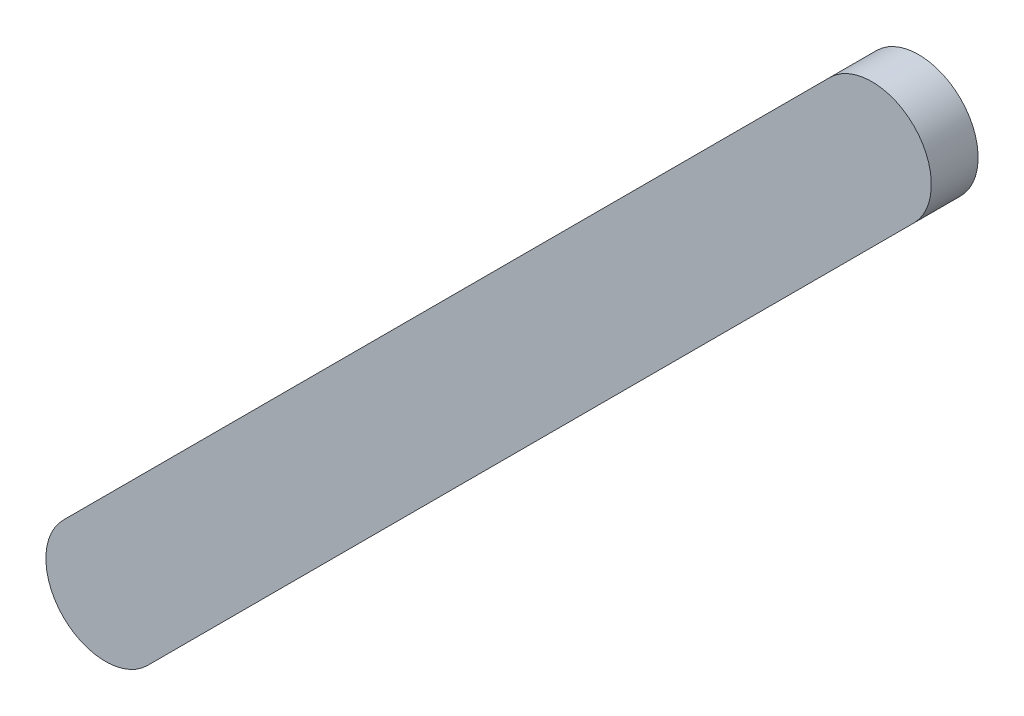
ISO-10303-21;
HEADER;
FILE_DESCRIPTION(('STEP AP214'),'2;1');
FILE_NAME('part.step','',(''),(''),'','','');
FILE_SCHEMA(('AUTOMOTIVE_DESIGN { 1 0 10303 214 1 1 1 1 }'));
ENDSEC;
DATA;
#1=APPLICATION_CONTEXT('core data for automotive mechanical design processes');
#2=APPLICATION_PROTOCOL_DEFINITION('international standard','automotive_design',2000,#1);
#3=PRODUCT_CONTEXT('',#1,'mechanical');
#4=PRODUCT('Part','Part','',(#3));
#5=PRODUCT_RELATED_PRODUCT_CATEGORY('part','',(#4));
#6=PRODUCT_DEFINITION_FORMATION('','',#4);
#7=PRODUCT_DEFINITION_CONTEXT('part definition',#1,'design');
#8=PRODUCT_DEFINITION('design','',#6,#7);
#9=PRODUCT_DEFINITION_SHAPE('','',#8);
#10=(LENGTH_UNIT() NAMED_UNIT(*) SI_UNIT(.MILLI.,.METRE.));
#11=(NAMED_UNIT(*) PLANE_ANGLE_UNIT() SI_UNIT($,.RADIAN.));
#12=(NAMED_UNIT(*) SI_UNIT($,.STERADIAN.) SOLID_ANGLE_UNIT());
#13=UNCERTAINTY_MEASURE_WITH_UNIT(LENGTH_MEASURE(1.E-05),#10,'distance_accuracy_value','');
#14=(GEOMETRIC_REPRESENTATION_CONTEXT(3) GLOBAL_UNCERTAINTY_ASSIGNED_CONTEXT((#13)) GLOBAL_UNIT_ASSIGNED_CONTEXT((#10,
#11,#12)) REPRESENTATION_CONTEXT('',''));
#15=CARTESIAN_POINT('',(0.,0.,0.));
#16=DIRECTION('',(0.,0.,1.));
#17=DIRECTION('',(1.,0.,0.));
#18=AXIS2_PLACEMENT_3D('',#15,#16,#17);
#19=CARTESIAN_POINT('',(113.2096034,66.36839406,0.));
#20=DIRECTION('',(-0.707106781186548,0.707106781186548,0.));
#21=DIRECTION('',(0.707106781186548,0.707106781186548,0.));
#22=AXIS2_PLACEMENT_3D('',#19,#20,#21);
#23=PLANE('',#22);
#24=DIRECTION('',(0.707106781186548,0.707106781186548,0.));
#25=VECTOR('',#24,1.);
#26=CARTESIAN_POINT('',(113.2096034,66.36839406,0.1999996));
#27=LINE('',#26,#25);
#28=CARTESIAN_POINT('',(113.2096034,66.36839406,0.1999996));
#29=VERTEX_POINT('',#28);
#30=CARTESIAN_POINT('',(116.48620594,69.6449966,0.1999996));
#31=VERTEX_POINT('',#30);
#32=EDGE_CURVE('E11',#29,#31,#27,.T.);
#33=ORIENTED_EDGE('',*,*,#32,.F.);
#34=DIRECTION('',(0.,0.,1.));
#35=VECTOR('',#34,1.);
#36=CARTESIAN_POINT('',(113.2096034,66.36839406,0.));
#37=LINE('',#36,#35);
#38=CARTESIAN_POINT('',(113.2096034,66.36839406,0.));
#39=VERTEX_POINT('',#38);
#40=EDGE_CURVE('E24',#39,#29,#37,.T.);
#41=ORIENTED_EDGE('',*,*,#40,.F.);
#42=DIRECTION('',(0.707106781186548,0.707106781186548,0.));
#43=VECTOR('',#42,1.);
#44=CARTESIAN_POINT('',(113.2096034,66.36839406,0.));
#45=LINE('',#44,#43);
#46=CARTESIAN_POINT('',(116.48620594,69.6449966,0.));
#47=VERTEX_POINT('',#46);
#48=EDGE_CURVE('E75',#39,#47,#45,.T.);
#49=ORIENTED_EDGE('',*,*,#48,.T.);
#50=DIRECTION('',(0.,0.,1.));
#51=VECTOR('',#50,1.);
#52=CARTESIAN_POINT('',(116.48620594,69.6449966,0.));
#53=LINE('',#52,#51);
#54=EDGE_CURVE('E37',#47,#31,#53,.T.);
#55=ORIENTED_EDGE('',*,*,#54,.T.);
#56=EDGE_LOOP('',(#33,#41,#49,#55));
#57=FACE_BOUND('',#56,.T.);
#58=ADVANCED_FACE('F17',(#57),#23,.F.);
#59=CARTESIAN_POINT('',(116.30660127,69.82460127,0.));
#60=DIRECTION('',(0.,0.,-1.));
#61=DIRECTION('',(0.707106781186548,-0.707106781186548,0.));
#62=AXIS2_PLACEMENT_3D('',#59,#60,#61);
#63=CYLINDRICAL_SURFACE('',#62,0.253999360179546);
#64=CARTESIAN_POINT('',(116.30660127,69.82460127,0.1999996));
#65=DIRECTION('',(0.,0.,1.));
#66=DIRECTION('',(0.707106781186548,-0.707106781186548,0.));
#67=AXIS2_PLACEMENT_3D('',#64,#65,#66);
#68=CIRCLE('',#67,0.253999360179546);
#69=CARTESIAN_POINT('',(116.1269966,70.00420594,0.1999996));
#70=VERTEX_POINT('',#69);
#71=EDGE_CURVE('E83',#31,#70,#68,.T.);
#72=ORIENTED_EDGE('',*,*,#71,.F.);
#73=ORIENTED_EDGE('',*,*,#54,.F.);
#74=CARTESIAN_POINT('',(116.30660127,69.82460127,0.));
#75=DIRECTION('',(0.,0.,1.));
#76=DIRECTION('',(0.707106781186548,-0.707106781186548,0.));
#77=AXIS2_PLACEMENT_3D('',#74,#75,#76);
#78=CIRCLE('',#77,0.253999360179546);
#79=CARTESIAN_POINT('',(116.1269966,70.00420594,0.));
#80=VERTEX_POINT('',#79);
#81=EDGE_CURVE('E81',#47,#80,#78,.T.);
#82=ORIENTED_EDGE('',*,*,#81,.T.);
#83=DIRECTION('',(0.,0.,1.));
#84=VECTOR('',#83,1.);
#85=CARTESIAN_POINT('',(116.1269966,70.00420594,0.));
#86=LINE('',#85,#84);
#87=EDGE_CURVE('E67',#80,#70,#86,.T.);
#88=ORIENTED_EDGE('',*,*,#87,.T.);
#89=EDGE_LOOP('',(#72,#73,#82,#88));
#90=FACE_BOUND('',#89,.T.);
#91=ADVANCED_FACE('F89',(#90),#63,.T.);
#92=CARTESIAN_POINT('',(116.1269966,70.00420594,0.));
#93=DIRECTION('',(0.707106781186548,-0.707106781186548,0.));
#94=DIRECTION('',(-0.707106781186548,-0.707106781186548,0.));
#95=AXIS2_PLACEMENT_3D('',#92,#93,#94);
#96=PLANE('',#95);
#97=DIRECTION('',(-0.707106781186548,-0.707106781186548,0.));
#98=VECTOR('',#97,1.);
#99=CARTESIAN_POINT('',(116.1269966,70.00420594,0.1999996));
#100=LINE('',#99,#98);
#101=CARTESIAN_POINT('',(112.85039406,66.7276034,0.1999996));
#102=VERTEX_POINT('',#101);
#103=EDGE_CURVE('E71',#70,#102,#100,.T.);
#104=ORIENTED_EDGE('',*,*,#103,.F.);
#105=ORIENTED_EDGE('',*,*,#87,.F.);
#106=DIRECTION('',(-0.707106781186548,-0.707106781186548,0.));
#107=VECTOR('',#106,1.);
#108=CARTESIAN_POINT('',(116.1269966,70.00420594,0.));
#109=LINE('',#108,#107);
#110=CARTESIAN_POINT('',(112.85039406,66.7276034,0.));
#111=VERTEX_POINT('',#110);
#112=EDGE_CURVE('E63',#80,#111,#109,.T.);
#113=ORIENTED_EDGE('',*,*,#112,.T.);
#114=DIRECTION('',(0.,0.,1.));
#115=VECTOR('',#114,1.);
#116=CARTESIAN_POINT('',(112.85039406,66.7276034,0.));
#117=LINE('',#116,#115);
#118=EDGE_CURVE('E53',#111,#102,#117,.T.);
#119=ORIENTED_EDGE('',*,*,#118,.T.);
#120=EDGE_LOOP('',(#104,#105,#113,#119));
#121=FACE_BOUND('',#120,.T.);
#122=ADVANCED_FACE('F66',(#121),#96,.F.);
#123=CARTESIAN_POINT('',(113.02999873,66.54799873,0.));
#124=DIRECTION('',(0.,0.,-1.));
#125=DIRECTION('',(-0.707106781186548,0.707106781186548,0.));
#126=AXIS2_PLACEMENT_3D('',#123,#124,#125);
#127=CYLINDRICAL_SURFACE('',#126,0.253999360179542);
#128=CARTESIAN_POINT('',(113.02999873,66.54799873,0.1999996));
#129=DIRECTION('',(0.,0.,1.));
#130=DIRECTION('',(-0.707106781186548,0.707106781186548,0.));
#131=AXIS2_PLACEMENT_3D('',#128,#129,#130);
#132=CIRCLE('',#131,0.253999360179542);
#133=EDGE_CURVE('E59',#102,#29,#132,.T.);
#134=ORIENTED_EDGE('',*,*,#133,.F.);
#135=ORIENTED_EDGE('',*,*,#118,.F.);
#136=CARTESIAN_POINT('',(113.02999873,66.54799873,0.));
#137=DIRECTION('',(0.,0.,1.));
#138=DIRECTION('',(-0.707106781186548,0.707106781186548,0.));
#139=AXIS2_PLACEMENT_3D('',#136,#137,#138);
#140=CIRCLE('',#139,0.253999360179542);
#141=EDGE_CURVE('E57',#111,#39,#140,.T.);
#142=ORIENTED_EDGE('',*,*,#141,.T.);
#143=ORIENTED_EDGE('',*,*,#40,.T.);
#144=EDGE_LOOP('',(#134,#135,#142,#143));
#145=FACE_BOUND('',#144,.T.);
#146=ADVANCED_FACE('F55',(#145),#127,.T.);
#147=CARTESIAN_POINT('',(113.2096034,66.36839406,0.));
#148=DIRECTION('',(0.,0.,-1.));
#149=DIRECTION('',(-1.,0.,0.));
#150=AXIS2_PLACEMENT_3D('',#147,#148,#149);
#151=PLANE('',#150);
#152=ORIENTED_EDGE('',*,*,#141,.F.);
#153=ORIENTED_EDGE('',*,*,#112,.F.);
#154=ORIENTED_EDGE('',*,*,#81,.F.);
#155=ORIENTED_EDGE('',*,*,#48,.F.);
#156=EDGE_LOOP('',(#152,#153,#154,#155));
#157=FACE_BOUND('',#156,.T.);
#158=ADVANCED_FACE('F74',(#157),#151,.T.);
#159=CARTESIAN_POINT('',(113.2096034,66.36839406,0.1999996));
#160=DIRECTION('',(0.,0.,-1.));
#161=DIRECTION('',(-1.,0.,0.));
#162=AXIS2_PLACEMENT_3D('',#159,#160,#161);
#163=PLANE('',#162);
#164=ORIENTED_EDGE('',*,*,#32,.T.);
#165=ORIENTED_EDGE('',*,*,#71,.T.);
#166=ORIENTED_EDGE('',*,*,#103,.T.);
#167=ORIENTED_EDGE('',*,*,#133,.T.);
#168=EDGE_LOOP('',(#164,#165,#166,#167));
#169=FACE_BOUND('',#168,.T.);
#170=ADVANCED_FACE('F91',(#169),#163,.F.);
#171=CLOSED_SHELL('',(#58,#91,#122,#146,#158,#170));
#172=MANIFOLD_SOLID_BREP('B1',#171);
#173=ADVANCED_BREP_SHAPE_REPRESENTATION('',(#18,#172),#14);
#174=SHAPE_DEFINITION_REPRESENTATION(#9,#173);
ENDSEC;
END-ISO-10303-21;
